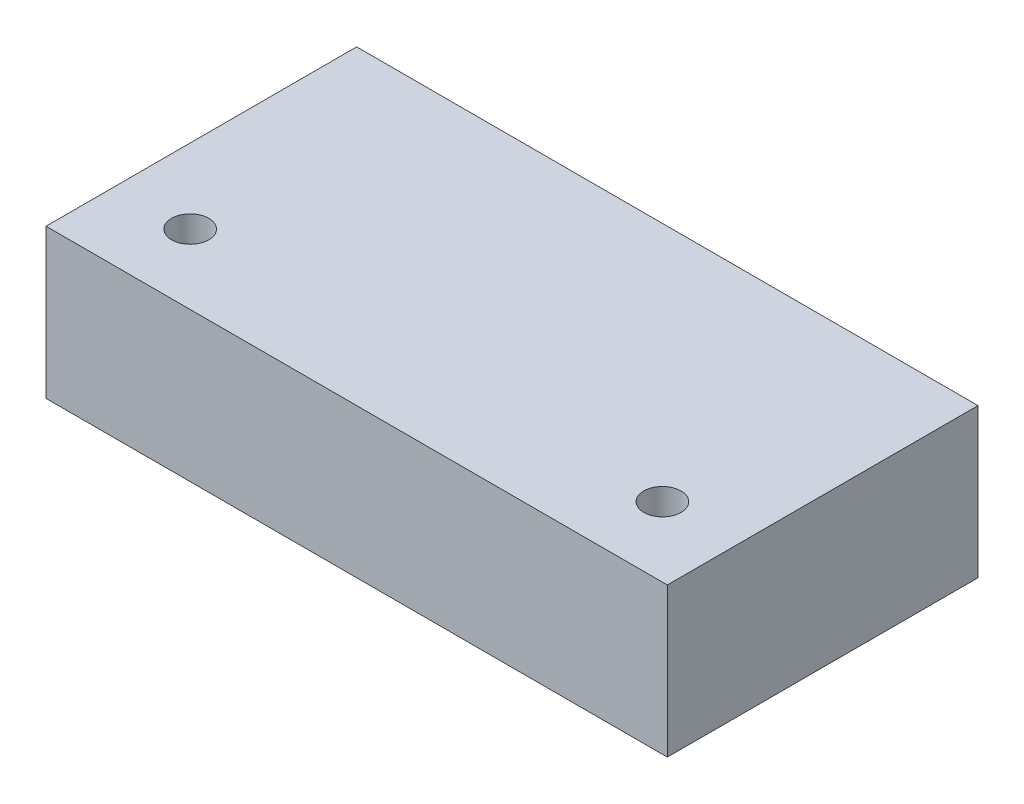
ISO-10303-21;
HEADER;
FILE_DESCRIPTION(('STEP AP214'),'2;1');
FILE_NAME('part.step','',(''),(''),'','','');
FILE_SCHEMA(('AUTOMOTIVE_DESIGN { 1 0 10303 214 1 1 1 1 }'));
ENDSEC;
DATA;
#1=APPLICATION_CONTEXT('core data for automotive mechanical design processes');
#2=APPLICATION_PROTOCOL_DEFINITION('international standard','automotive_design',2000,#1);
#3=PRODUCT_CONTEXT('',#1,'mechanical');
#4=PRODUCT('Part','Part','',(#3));
#5=PRODUCT_RELATED_PRODUCT_CATEGORY('part','',(#4));
#6=PRODUCT_DEFINITION_FORMATION('','',#4);
#7=PRODUCT_DEFINITION_CONTEXT('part definition',#1,'design');
#8=PRODUCT_DEFINITION('design','',#6,#7);
#9=PRODUCT_DEFINITION_SHAPE('','',#8);
#10=(LENGTH_UNIT() NAMED_UNIT(*) SI_UNIT(.MILLI.,.METRE.));
#11=(NAMED_UNIT(*) PLANE_ANGLE_UNIT() SI_UNIT($,.RADIAN.));
#12=(NAMED_UNIT(*) SI_UNIT($,.STERADIAN.) SOLID_ANGLE_UNIT());
#13=UNCERTAINTY_MEASURE_WITH_UNIT(LENGTH_MEASURE(1.E-05),#10,'distance_accuracy_value','');
#14=(GEOMETRIC_REPRESENTATION_CONTEXT(3) GLOBAL_UNCERTAINTY_ASSIGNED_CONTEXT((#13)) GLOBAL_UNIT_ASSIGNED_CONTEXT((#10,
#11,#12)) REPRESENTATION_CONTEXT('',''));
#15=CARTESIAN_POINT('',(0.,0.,0.));
#16=DIRECTION('',(0.,0.,1.));
#17=DIRECTION('',(1.,0.,0.));
#18=AXIS2_PLACEMENT_3D('',#15,#16,#17);
#19=CARTESIAN_POINT('',(25.,6.,25.));
#20=DIRECTION('',(-1.,0.,0.));
#21=DIRECTION('',(0.,0.,1.));
#22=AXIS2_PLACEMENT_3D('',#19,#20,#21);
#23=PLANE('',#22);
#24=DIRECTION('',(0.,1.,0.));
#25=VECTOR('',#24,1.);
#26=CARTESIAN_POINT('',(25.,6.,0.));
#27=LINE('',#26,#25);
#28=CARTESIAN_POINT('',(25.,-6.,0.));
#29=VERTEX_POINT('',#28);
#30=CARTESIAN_POINT('',(25.,6.,0.));
#31=VERTEX_POINT('',#30);
#32=EDGE_CURVE('E96',#29,#31,#27,.T.);
#33=ORIENTED_EDGE('',*,*,#32,.T.);
#34=DIRECTION('',(0.,0.,-1.));
#35=VECTOR('',#34,1.);
#36=CARTESIAN_POINT('',(25.,6.,25.));
#37=LINE('',#36,#35);
#38=CARTESIAN_POINT('',(25.,6.,25.));
#39=VERTEX_POINT('',#38);
#40=EDGE_CURVE('E11',#39,#31,#37,.T.);
#41=ORIENTED_EDGE('',*,*,#40,.F.);
#42=DIRECTION('',(0.,1.,0.));
#43=VECTOR('',#42,1.);
#44=CARTESIAN_POINT('',(25.,6.,25.));
#45=LINE('',#44,#43);
#46=CARTESIAN_POINT('',(25.,-6.,25.));
#47=VERTEX_POINT('',#46);
#48=EDGE_CURVE('E84',#47,#39,#45,.T.);
#49=ORIENTED_EDGE('',*,*,#48,.F.);
#50=DIRECTION('',(0.,0.,-1.));
#51=VECTOR('',#50,1.);
#52=CARTESIAN_POINT('',(25.,-6.,25.));
#53=LINE('',#52,#51);
#54=EDGE_CURVE('E92',#47,#29,#53,.T.);
#55=ORIENTED_EDGE('',*,*,#54,.T.);
#56=EDGE_LOOP('',(#33,#41,#49,#55));
#57=FACE_BOUND('',#56,.T.);
#58=ADVANCED_FACE('F33',(#57),#23,.F.);
#59=CARTESIAN_POINT('',(-25.,6.,25.));
#60=DIRECTION('',(0.,-1.,0.));
#61=DIRECTION('',(0.,0.,-1.));
#62=AXIS2_PLACEMENT_3D('',#59,#60,#61);
#63=PLANE('',#62);
#64=CARTESIAN_POINT('',(19.,6.,19.3958636194012));
#65=DIRECTION('',(0.,-1.,0.));
#66=DIRECTION('',(0.,0.,-1.));
#67=AXIS2_PLACEMENT_3D('',#64,#65,#66);
#68=CIRCLE('',#67,1.5);
#69=CARTESIAN_POINT('',(19.,6.,17.8958636194012));
#70=VERTEX_POINT('',#69);
#71=EDGE_CURVE('E115',#70,#70,#68,.F.);
#72=ORIENTED_EDGE('',*,*,#71,.F.);
#73=EDGE_LOOP('',(#72));
#74=FACE_BOUND('',#73,.T.);
#75=CARTESIAN_POINT('',(-19.,6.,19.3958636194012));
#76=DIRECTION('',(0.,-1.,0.));
#77=DIRECTION('',(0.,0.,-1.));
#78=AXIS2_PLACEMENT_3D('',#75,#76,#77);
#79=CIRCLE('',#78,1.5);
#80=CARTESIAN_POINT('',(-19.,6.,17.8958636194012));
#81=VERTEX_POINT('',#80);
#82=EDGE_CURVE('E99',#81,#81,#79,.F.);
#83=ORIENTED_EDGE('',*,*,#82,.F.);
#84=EDGE_LOOP('',(#83));
#85=FACE_BOUND('',#84,.T.);
#86=DIRECTION('',(-1.,0.,0.));
#87=VECTOR('',#86,1.);
#88=CARTESIAN_POINT('',(-25.,6.,0.));
#89=LINE('',#88,#87);
#90=CARTESIAN_POINT('',(-25.,6.,0.));
#91=VERTEX_POINT('',#90);
#92=EDGE_CURVE('E88',#31,#91,#89,.T.);
#93=ORIENTED_EDGE('',*,*,#92,.T.);
#94=DIRECTION('',(0.,0.,-1.));
#95=VECTOR('',#94,1.);
#96=CARTESIAN_POINT('',(-25.,6.,25.));
#97=LINE('',#96,#95);
#98=CARTESIAN_POINT('',(-25.,6.,25.));
#99=VERTEX_POINT('',#98);
#100=EDGE_CURVE('E41',#99,#91,#97,.T.);
#101=ORIENTED_EDGE('',*,*,#100,.F.);
#102=DIRECTION('',(-1.,0.,0.));
#103=VECTOR('',#102,1.);
#104=CARTESIAN_POINT('',(-25.,6.,25.));
#105=LINE('',#104,#103);
#106=EDGE_CURVE('E79',#39,#99,#105,.T.);
#107=ORIENTED_EDGE('',*,*,#106,.F.);
#108=ORIENTED_EDGE('',*,*,#40,.T.);
#109=EDGE_LOOP('',(#93,#101,#107,#108));
#110=FACE_BOUND('',#109,.T.);
#111=ADVANCED_FACE('F87',(#74,#85,#110),#63,.F.);
#112=CARTESIAN_POINT('',(-25.,6.,25.));
#113=DIRECTION('',(1.,0.,0.));
#114=DIRECTION('',(0.,0.,-1.));
#115=AXIS2_PLACEMENT_3D('',#112,#113,#114);
#116=PLANE('',#115);
#117=DIRECTION('',(0.,-1.,0.));
#118=VECTOR('',#117,1.);
#119=CARTESIAN_POINT('',(-25.,6.,0.));
#120=LINE('',#119,#118);
#121=CARTESIAN_POINT('',(-25.,-6.,0.));
#122=VERTEX_POINT('',#121);
#123=EDGE_CURVE('E66',#91,#122,#120,.T.);
#124=ORIENTED_EDGE('',*,*,#123,.T.);
#125=DIRECTION('',(0.,0.,-1.));
#126=VECTOR('',#125,1.);
#127=CARTESIAN_POINT('',(-25.,-6.,25.));
#128=LINE('',#127,#126);
#129=CARTESIAN_POINT('',(-25.,-6.,25.));
#130=VERTEX_POINT('',#129);
#131=EDGE_CURVE('E89',#130,#122,#128,.T.);
#132=ORIENTED_EDGE('',*,*,#131,.F.);
#133=DIRECTION('',(0.,-1.,0.));
#134=VECTOR('',#133,1.);
#135=CARTESIAN_POINT('',(-25.,6.,25.));
#136=LINE('',#135,#134);
#137=EDGE_CURVE('E82',#99,#130,#136,.T.);
#138=ORIENTED_EDGE('',*,*,#137,.F.);
#139=ORIENTED_EDGE('',*,*,#100,.T.);
#140=EDGE_LOOP('',(#124,#132,#138,#139));
#141=FACE_BOUND('',#140,.T.);
#142=ADVANCED_FACE('F90',(#141),#116,.F.);
#143=CARTESIAN_POINT('',(-25.,-6.,25.));
#144=DIRECTION('',(0.,1.,0.));
#145=DIRECTION('',(0.,0.,1.));
#146=AXIS2_PLACEMENT_3D('',#143,#144,#145);
#147=PLANE('',#146);
#148=CARTESIAN_POINT('',(19.,-6.,19.3958636194012));
#149=DIRECTION('',(0.,-1.,0.));
#150=DIRECTION('',(0.,0.,-1.));
#151=AXIS2_PLACEMENT_3D('',#148,#149,#150);
#152=CIRCLE('',#151,1.5);
#153=CARTESIAN_POINT('',(19.,-6.,17.8958636194012));
#154=VERTEX_POINT('',#153);
#155=EDGE_CURVE('E118',#154,#154,#152,.T.);
#156=ORIENTED_EDGE('',*,*,#155,.F.);
#157=EDGE_LOOP('',(#156));
#158=FACE_BOUND('',#157,.T.);
#159=CARTESIAN_POINT('',(-19.,-6.,19.3958636194012));
#160=DIRECTION('',(0.,-1.,0.));
#161=DIRECTION('',(0.,0.,-1.));
#162=AXIS2_PLACEMENT_3D('',#159,#160,#161);
#163=CIRCLE('',#162,1.5);
#164=CARTESIAN_POINT('',(-19.,-6.,17.8958636194012));
#165=VERTEX_POINT('',#164);
#166=EDGE_CURVE('E112',#165,#165,#163,.T.);
#167=ORIENTED_EDGE('',*,*,#166,.F.);
#168=EDGE_LOOP('',(#167));
#169=FACE_BOUND('',#168,.T.);
#170=DIRECTION('',(1.,0.,0.));
#171=VECTOR('',#170,1.);
#172=CARTESIAN_POINT('',(-25.,-6.,0.));
#173=LINE('',#172,#171);
#174=EDGE_CURVE('E72',#122,#29,#173,.T.);
#175=ORIENTED_EDGE('',*,*,#174,.T.);
#176=ORIENTED_EDGE('',*,*,#54,.F.);
#177=DIRECTION('',(1.,0.,0.));
#178=VECTOR('',#177,1.);
#179=CARTESIAN_POINT('',(-25.,-6.,25.));
#180=LINE('',#179,#178);
#181=EDGE_CURVE('E49',#130,#47,#180,.T.);
#182=ORIENTED_EDGE('',*,*,#181,.F.);
#183=ORIENTED_EDGE('',*,*,#131,.T.);
#184=EDGE_LOOP('',(#175,#176,#182,#183));
#185=FACE_BOUND('',#184,.T.);
#186=ADVANCED_FACE('F104',(#158,#169,#185),#147,.F.);
#187=CARTESIAN_POINT('',(0.,0.,25.));
#188=DIRECTION('',(0.,0.,1.));
#189=DIRECTION('',(1.,0.,0.));
#190=AXIS2_PLACEMENT_3D('',#187,#188,#189);
#191=PLANE('',#190);
#192=ORIENTED_EDGE('',*,*,#48,.T.);
#193=ORIENTED_EDGE('',*,*,#106,.T.);
#194=ORIENTED_EDGE('',*,*,#137,.T.);
#195=ORIENTED_EDGE('',*,*,#181,.T.);
#196=EDGE_LOOP('',(#192,#193,#194,#195));
#197=FACE_BOUND('',#196,.T.);
#198=ADVANCED_FACE('F80',(#197),#191,.T.);
#199=CARTESIAN_POINT('',(0.,0.,0.));
#200=DIRECTION('',(0.,0.,1.));
#201=DIRECTION('',(1.,0.,0.));
#202=AXIS2_PLACEMENT_3D('',#199,#200,#201);
#203=PLANE('',#202);
#204=ORIENTED_EDGE('',*,*,#32,.F.);
#205=ORIENTED_EDGE('',*,*,#174,.F.);
#206=ORIENTED_EDGE('',*,*,#123,.F.);
#207=ORIENTED_EDGE('',*,*,#92,.F.);
#208=EDGE_LOOP('',(#204,#205,#206,#207));
#209=FACE_BOUND('',#208,.T.);
#210=ADVANCED_FACE('F107',(#209),#203,.F.);
#211=CARTESIAN_POINT('',(-19.,6.001,19.3958636194012));
#212=DIRECTION('',(0.,-1.,0.));
#213=DIRECTION('',(0.,0.,-1.));
#214=AXIS2_PLACEMENT_3D('',#211,#212,#213);
#215=CYLINDRICAL_SURFACE('',#214,1.5);
#216=ORIENTED_EDGE('',*,*,#166,.T.);
#217=EDGE_LOOP('',(#216));
#218=FACE_BOUND('',#217,.T.);
#219=ORIENTED_EDGE('',*,*,#82,.T.);
#220=EDGE_LOOP('',(#219));
#221=FACE_BOUND('',#220,.T.);
#222=ADVANCED_FACE('F130',(#218,#221),#215,.F.);
#223=CARTESIAN_POINT('',(19.,6.001,19.3958636194012));
#224=DIRECTION('',(0.,-1.,0.));
#225=DIRECTION('',(0.,0.,-1.));
#226=AXIS2_PLACEMENT_3D('',#223,#224,#225);
#227=CYLINDRICAL_SURFACE('',#226,1.5);
#228=ORIENTED_EDGE('',*,*,#155,.T.);
#229=EDGE_LOOP('',(#228));
#230=FACE_BOUND('',#229,.T.);
#231=ORIENTED_EDGE('',*,*,#71,.T.);
#232=EDGE_LOOP('',(#231));
#233=FACE_BOUND('',#232,.T.);
#234=ADVANCED_FACE('F122',(#230,#233),#227,.F.);
#235=CLOSED_SHELL('',(#58,#111,#142,#186,#198,#210,#222,#234));
#236=MANIFOLD_SOLID_BREP('B2',#235);
#237=ADVANCED_BREP_SHAPE_REPRESENTATION('',(#18,#236),#14);
#238=SHAPE_DEFINITION_REPRESENTATION(#9,#237);
ENDSEC;
END-ISO-10303-21;
